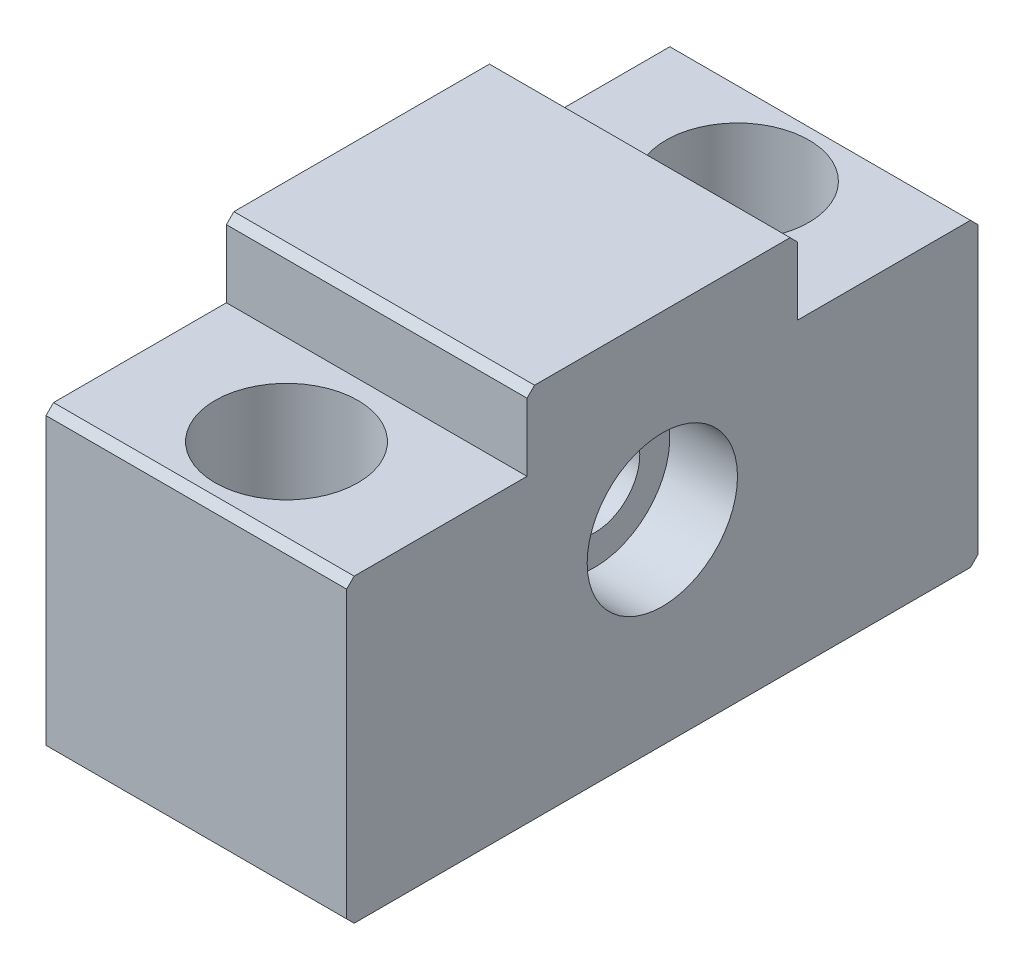
ISO-10303-21;
HEADER;
FILE_DESCRIPTION(('STEP AP214'),'2;1');
FILE_NAME('part.step','',(''),(''),'','','');
FILE_SCHEMA(('AUTOMOTIVE_DESIGN { 1 0 10303 214 1 1 1 1 }'));
ENDSEC;
DATA;
#1=APPLICATION_CONTEXT('core data for automotive mechanical design processes');
#2=APPLICATION_PROTOCOL_DEFINITION('international standard','automotive_design',2000,#1);
#3=PRODUCT_CONTEXT('',#1,'mechanical');
#4=PRODUCT('Part','Part','',(#3));
#5=PRODUCT_RELATED_PRODUCT_CATEGORY('part','',(#4));
#6=PRODUCT_DEFINITION_FORMATION('','',#4);
#7=PRODUCT_DEFINITION_CONTEXT('part definition',#1,'design');
#8=PRODUCT_DEFINITION('design','',#6,#7);
#9=PRODUCT_DEFINITION_SHAPE('','',#8);
#10=(LENGTH_UNIT() NAMED_UNIT(*) SI_UNIT(.MILLI.,.METRE.));
#11=(NAMED_UNIT(*) PLANE_ANGLE_UNIT() SI_UNIT($,.RADIAN.));
#12=(NAMED_UNIT(*) SI_UNIT($,.STERADIAN.) SOLID_ANGLE_UNIT());
#13=UNCERTAINTY_MEASURE_WITH_UNIT(LENGTH_MEASURE(1.E-05),#10,'distance_accuracy_value','');
#14=(GEOMETRIC_REPRESENTATION_CONTEXT(3) GLOBAL_UNCERTAINTY_ASSIGNED_CONTEXT((#13)) GLOBAL_UNIT_ASSIGNED_CONTEXT((#10,
#11,#12)) REPRESENTATION_CONTEXT('',''));
#15=CARTESIAN_POINT('',(0.,0.,0.));
#16=DIRECTION('',(0.,0.,1.));
#17=DIRECTION('',(1.,0.,0.));
#18=AXIS2_PLACEMENT_3D('',#15,#16,#17);
#19=CARTESIAN_POINT('',(-10.,19.5,21.));
#20=DIRECTION('',(0.,0.707106781186548,0.707106781186548));
#21=DIRECTION('',(1.,0.,0.));
#22=AXIS2_PLACEMENT_3D('',#19,#20,#21);
#23=PLANE('',#22);
#24=DIRECTION('',(0.,-0.707106781186548,0.707106781186548));
#25=VECTOR('',#24,1.);
#26=CARTESIAN_POINT('',(-10.,20.,20.5));
#27=LINE('',#26,#25);
#28=CARTESIAN_POINT('',(-10.,20.,20.5));
#29=VERTEX_POINT('',#28);
#30=CARTESIAN_POINT('',(-10.,19.5,21.));
#31=VERTEX_POINT('',#30);
#32=EDGE_CURVE('E120',#29,#31,#27,.T.);
#33=ORIENTED_EDGE('',*,*,#32,.T.);
#34=DIRECTION('',(1.,0.,0.));
#35=VECTOR('',#34,1.);
#36=CARTESIAN_POINT('',(-10.,19.5,21.));
#37=LINE('',#36,#35);
#38=CARTESIAN_POINT('',(10.,19.5,21.));
#39=VERTEX_POINT('',#38);
#40=EDGE_CURVE('E134',#39,#31,#37,.F.);
#41=ORIENTED_EDGE('',*,*,#40,.F.);
#42=DIRECTION('',(0.,0.707106781186548,-0.707106781186548));
#43=VECTOR('',#42,1.);
#44=CARTESIAN_POINT('',(10.,19.5,21.));
#45=LINE('',#44,#43);
#46=CARTESIAN_POINT('',(10.,20.,20.5));
#47=VERTEX_POINT('',#46);
#48=EDGE_CURVE('E140',#47,#39,#45,.F.);
#49=ORIENTED_EDGE('',*,*,#48,.F.);
#50=DIRECTION('',(-1.,0.,0.));
#51=VECTOR('',#50,1.);
#52=CARTESIAN_POINT('',(10.,20.,20.5));
#53=LINE('',#52,#51);
#54=EDGE_CURVE('E128',#47,#29,#53,.T.);
#55=ORIENTED_EDGE('',*,*,#54,.T.);
#56=EDGE_LOOP('',(#33,#41,#49,#55));
#57=FACE_BOUND('',#56,.T.);
#58=ADVANCED_FACE('F17',(#57),#23,.T.);
#59=CARTESIAN_POINT('',(10.,0.5,21.));
#60=DIRECTION('',(0.,0.,1.));
#61=DIRECTION('',(0.,1.,0.));
#62=AXIS2_PLACEMENT_3D('',#59,#60,#61);
#63=PLANE('',#62);
#64=DIRECTION('',(0.,-1.,0.));
#65=VECTOR('',#64,1.);
#66=CARTESIAN_POINT('',(-10.,19.5,21.));
#67=LINE('',#66,#65);
#68=CARTESIAN_POINT('',(-10.,0.5,21.));
#69=VERTEX_POINT('',#68);
#70=EDGE_CURVE('E116',#31,#69,#67,.T.);
#71=ORIENTED_EDGE('',*,*,#70,.T.);
#72=DIRECTION('',(1.,0.,0.));
#73=VECTOR('',#72,1.);
#74=CARTESIAN_POINT('',(-10.,0.5,21.));
#75=LINE('',#74,#73);
#76=CARTESIAN_POINT('',(10.,0.5,21.));
#77=VERTEX_POINT('',#76);
#78=EDGE_CURVE('E127',#77,#69,#75,.F.);
#79=ORIENTED_EDGE('',*,*,#78,.F.);
#80=DIRECTION('',(0.,1.,0.));
#81=VECTOR('',#80,1.);
#82=CARTESIAN_POINT('',(10.,0.5,21.));
#83=LINE('',#82,#81);
#84=EDGE_CURVE('E139',#39,#77,#83,.F.);
#85=ORIENTED_EDGE('',*,*,#84,.F.);
#86=ORIENTED_EDGE('',*,*,#40,.T.);
#87=EDGE_LOOP('',(#71,#79,#85,#86));
#88=FACE_BOUND('',#87,.T.);
#89=ADVANCED_FACE('F138',(#88),#63,.T.);
#90=CARTESIAN_POINT('',(-10.,0.,20.5));
#91=DIRECTION('',(0.,-0.707106781186548,0.707106781186547));
#92=DIRECTION('',(1.,0.,0.));
#93=AXIS2_PLACEMENT_3D('',#90,#91,#92);
#94=PLANE('',#93);
#95=DIRECTION('',(0.,-0.707106781186547,-0.707106781186548));
#96=VECTOR('',#95,1.);
#97=CARTESIAN_POINT('',(-10.,0.5,21.));
#98=LINE('',#97,#96);
#99=CARTESIAN_POINT('',(-10.,0.,20.5));
#100=VERTEX_POINT('',#99);
#101=EDGE_CURVE('E122',#69,#100,#98,.T.);
#102=ORIENTED_EDGE('',*,*,#101,.T.);
#103=DIRECTION('',(1.,0.,0.));
#104=VECTOR('',#103,1.);
#105=CARTESIAN_POINT('',(-10.,0.,20.5));
#106=LINE('',#105,#104);
#107=CARTESIAN_POINT('',(10.,0.,20.5));
#108=VERTEX_POINT('',#107);
#109=EDGE_CURVE('E162',#108,#100,#106,.F.);
#110=ORIENTED_EDGE('',*,*,#109,.F.);
#111=DIRECTION('',(0.,0.707106781186547,0.707106781186548));
#112=VECTOR('',#111,1.);
#113=CARTESIAN_POINT('',(10.,0.,20.5));
#114=LINE('',#113,#112);
#115=EDGE_CURVE('E167',#77,#108,#114,.F.);
#116=ORIENTED_EDGE('',*,*,#115,.F.);
#117=ORIENTED_EDGE('',*,*,#78,.T.);
#118=EDGE_LOOP('',(#102,#110,#116,#117));
#119=FACE_BOUND('',#118,.T.);
#120=ADVANCED_FACE('F379',(#119),#94,.T.);
#121=CARTESIAN_POINT('',(-10.,0.,-20.5));
#122=DIRECTION('',(0.,-1.,0.));
#123=DIRECTION('',(1.,0.,0.));
#124=AXIS2_PLACEMENT_3D('',#121,#122,#123);
#125=PLANE('',#124);
#126=DIRECTION('',(0.,0.,-1.));
#127=VECTOR('',#126,1.);
#128=CARTESIAN_POINT('',(-10.,0.,20.5));
#129=LINE('',#128,#127);
#130=CARTESIAN_POINT('',(-10.,0.,-20.5));
#131=VERTEX_POINT('',#130);
#132=EDGE_CURVE('E171',#100,#131,#129,.T.);
#133=ORIENTED_EDGE('',*,*,#132,.T.);
#134=DIRECTION('',(1.,0.,0.));
#135=VECTOR('',#134,1.);
#136=CARTESIAN_POINT('',(-10.,0.,-20.5));
#137=LINE('',#136,#135);
#138=CARTESIAN_POINT('',(10.,0.,-20.5));
#139=VERTEX_POINT('',#138);
#140=EDGE_CURVE('E176',#139,#131,#137,.F.);
#141=ORIENTED_EDGE('',*,*,#140,.F.);
#142=DIRECTION('',(0.,0.,1.));
#143=VECTOR('',#142,1.);
#144=CARTESIAN_POINT('',(10.,0.,-20.5));
#145=LINE('',#144,#143);
#146=EDGE_CURVE('E181',#108,#139,#145,.F.);
#147=ORIENTED_EDGE('',*,*,#146,.F.);
#148=ORIENTED_EDGE('',*,*,#109,.T.);
#149=EDGE_LOOP('',(#133,#141,#147,#148));
#150=FACE_BOUND('',#149,.T.);
#151=CARTESIAN_POINT('',(0.,0.,-15.));
#152=DIRECTION('',(0.,1.,0.));
#153=DIRECTION('',(0.,0.,-1.));
#154=AXIS2_PLACEMENT_3D('',#151,#152,#153);
#155=CIRCLE('',#154,2.75);
#156=CARTESIAN_POINT('',(0.,0.,-17.75));
#157=VERTEX_POINT('',#156);
#158=EDGE_CURVE('E185',#157,#157,#155,.F.);
#159=ORIENTED_EDGE('',*,*,#158,.F.);
#160=EDGE_LOOP('',(#159));
#161=FACE_BOUND('',#160,.T.);
#162=CARTESIAN_POINT('',(0.,0.,15.));
#163=DIRECTION('',(0.,1.,0.));
#164=DIRECTION('',(0.,0.,-1.));
#165=AXIS2_PLACEMENT_3D('',#162,#163,#164);
#166=CIRCLE('',#165,2.75);
#167=CARTESIAN_POINT('',(0.,0.,12.25));
#168=VERTEX_POINT('',#167);
#169=EDGE_CURVE('E190',#168,#168,#166,.T.);
#170=ORIENTED_EDGE('',*,*,#169,.T.);
#171=EDGE_LOOP('',(#170));
#172=FACE_BOUND('',#171,.T.);
#173=ADVANCED_FACE('F384',(#150,#161,#172),#125,.T.);
#174=CARTESIAN_POINT('',(-10.,0.500000000000003,-21.));
#175=DIRECTION('',(0.,-0.707106781186548,-0.707106781186547));
#176=DIRECTION('',(1.,0.,0.));
#177=AXIS2_PLACEMENT_3D('',#174,#175,#176);
#178=PLANE('',#177);
#179=DIRECTION('',(0.,0.707106781186546,-0.707106781186549));
#180=VECTOR('',#179,1.);
#181=CARTESIAN_POINT('',(-10.,0.,-20.5));
#182=LINE('',#181,#180);
#183=CARTESIAN_POINT('',(-10.,0.500000000000003,-21.));
#184=VERTEX_POINT('',#183);
#185=EDGE_CURVE('E193',#131,#184,#182,.T.);
#186=ORIENTED_EDGE('',*,*,#185,.T.);
#187=DIRECTION('',(1.,0.,0.));
#188=VECTOR('',#187,1.);
#189=CARTESIAN_POINT('',(-10.,0.500000000000003,-21.));
#190=LINE('',#189,#188);
#191=CARTESIAN_POINT('',(10.,0.499999999999999,-21.));
#192=VERTEX_POINT('',#191);
#193=EDGE_CURVE('E196',#192,#184,#190,.F.);
#194=ORIENTED_EDGE('',*,*,#193,.F.);
#195=DIRECTION('',(0.,-0.707106781186547,0.707106781186548));
#196=VECTOR('',#195,1.);
#197=CARTESIAN_POINT('',(10.,0.499999999999999,-21.));
#198=LINE('',#197,#196);
#199=EDGE_CURVE('E201',#139,#192,#198,.F.);
#200=ORIENTED_EDGE('',*,*,#199,.F.);
#201=ORIENTED_EDGE('',*,*,#140,.T.);
#202=EDGE_LOOP('',(#186,#194,#200,#201));
#203=FACE_BOUND('',#202,.T.);
#204=ADVANCED_FACE('F388',(#203),#178,.T.);
#205=CARTESIAN_POINT('',(-10.,0.5,-21.));
#206=DIRECTION('',(0.,0.,-1.));
#207=DIRECTION('',(0.,1.,0.));
#208=AXIS2_PLACEMENT_3D('',#205,#206,#207);
#209=PLANE('',#208);
#210=DIRECTION('',(0.,1.,0.));
#211=VECTOR('',#210,1.);
#212=CARTESIAN_POINT('',(-10.,0.5,-21.));
#213=LINE('',#212,#211);
#214=CARTESIAN_POINT('',(-10.,19.5,-21.));
#215=VERTEX_POINT('',#214);
#216=EDGE_CURVE('E205',#184,#215,#213,.T.);
#217=ORIENTED_EDGE('',*,*,#216,.T.);
#218=DIRECTION('',(1.,0.,0.));
#219=VECTOR('',#218,1.);
#220=CARTESIAN_POINT('',(-10.,19.5,-21.));
#221=LINE('',#220,#219);
#222=CARTESIAN_POINT('',(10.,19.5,-21.));
#223=VERTEX_POINT('',#222);
#224=EDGE_CURVE('E210',#223,#215,#221,.F.);
#225=ORIENTED_EDGE('',*,*,#224,.F.);
#226=DIRECTION('',(0.,-1.,0.));
#227=VECTOR('',#226,1.);
#228=CARTESIAN_POINT('',(10.,19.5,-21.));
#229=LINE('',#228,#227);
#230=EDGE_CURVE('E215',#192,#223,#229,.F.);
#231=ORIENTED_EDGE('',*,*,#230,.F.);
#232=ORIENTED_EDGE('',*,*,#193,.T.);
#233=EDGE_LOOP('',(#217,#225,#231,#232));
#234=FACE_BOUND('',#233,.T.);
#235=ADVANCED_FACE('F392',(#234),#209,.T.);
#236=CARTESIAN_POINT('',(-10.,20.,-20.5));
#237=DIRECTION('',(0.,0.707106781186548,-0.707106781186548));
#238=DIRECTION('',(1.,0.,0.));
#239=AXIS2_PLACEMENT_3D('',#236,#237,#238);
#240=PLANE('',#239);
#241=DIRECTION('',(0.,0.707106781186548,0.707106781186548));
#242=VECTOR('',#241,1.);
#243=CARTESIAN_POINT('',(-10.,19.5,-21.));
#244=LINE('',#243,#242);
#245=CARTESIAN_POINT('',(-10.,20.,-20.5));
#246=VERTEX_POINT('',#245);
#247=EDGE_CURVE('E219',#215,#246,#244,.T.);
#248=ORIENTED_EDGE('',*,*,#247,.T.);
#249=DIRECTION('',(1.,0.,0.));
#250=VECTOR('',#249,1.);
#251=CARTESIAN_POINT('',(-10.,20.,-20.5));
#252=LINE('',#251,#250);
#253=CARTESIAN_POINT('',(10.,20.,-20.5));
#254=VERTEX_POINT('',#253);
#255=EDGE_CURVE('E224',#254,#246,#252,.F.);
#256=ORIENTED_EDGE('',*,*,#255,.F.);
#257=DIRECTION('',(0.,-0.707106781186548,-0.707106781186548));
#258=VECTOR('',#257,1.);
#259=CARTESIAN_POINT('',(10.,20.,-20.5));
#260=LINE('',#259,#258);
#261=EDGE_CURVE('E229',#223,#254,#260,.F.);
#262=ORIENTED_EDGE('',*,*,#261,.F.);
#263=ORIENTED_EDGE('',*,*,#224,.T.);
#264=EDGE_LOOP('',(#248,#256,#262,#263));
#265=FACE_BOUND('',#264,.T.);
#266=ADVANCED_FACE('F396',(#265),#240,.T.);
#267=CARTESIAN_POINT('',(-10.,20.,-9.));
#268=DIRECTION('',(0.,1.,0.));
#269=DIRECTION('',(1.,0.,0.));
#270=AXIS2_PLACEMENT_3D('',#267,#268,#269);
#271=PLANE('',#270);
#272=DIRECTION('',(0.,0.,1.));
#273=VECTOR('',#272,1.);
#274=CARTESIAN_POINT('',(-10.,20.,-20.5));
#275=LINE('',#274,#273);
#276=CARTESIAN_POINT('',(-10.,20.,-9.));
#277=VERTEX_POINT('',#276);
#278=EDGE_CURVE('E233',#246,#277,#275,.T.);
#279=ORIENTED_EDGE('',*,*,#278,.T.);
#280=DIRECTION('',(1.,0.,0.));
#281=VECTOR('',#280,1.);
#282=CARTESIAN_POINT('',(-10.,20.,-9.));
#283=LINE('',#282,#281);
#284=CARTESIAN_POINT('',(10.,20.,-9.));
#285=VERTEX_POINT('',#284);
#286=EDGE_CURVE('E238',#285,#277,#283,.F.);
#287=ORIENTED_EDGE('',*,*,#286,.F.);
#288=DIRECTION('',(0.,0.,-1.));
#289=VECTOR('',#288,1.);
#290=CARTESIAN_POINT('',(10.,20.,-9.));
#291=LINE('',#290,#289);
#292=EDGE_CURVE('E243',#254,#285,#291,.F.);
#293=ORIENTED_EDGE('',*,*,#292,.F.);
#294=ORIENTED_EDGE('',*,*,#255,.T.);
#295=EDGE_LOOP('',(#279,#287,#293,#294));
#296=FACE_BOUND('',#295,.T.);
#297=CARTESIAN_POINT('',(0.,20.,-15.));
#298=DIRECTION('',(0.,-1.,0.));
#299=DIRECTION('',(0.,0.,1.));
#300=AXIS2_PLACEMENT_3D('',#297,#298,#299);
#301=CIRCLE('',#300,4.75);
#302=CARTESIAN_POINT('',(0.,20.,-10.25));
#303=VERTEX_POINT('',#302);
#304=EDGE_CURVE('E247',#303,#303,#301,.T.);
#305=ORIENTED_EDGE('',*,*,#304,.T.);
#306=EDGE_LOOP('',(#305));
#307=FACE_BOUND('',#306,.T.);
#308=ADVANCED_FACE('F400',(#296,#307),#271,.T.);
#309=CARTESIAN_POINT('',(-10.,20.,-9.));
#310=DIRECTION('',(0.,0.,-1.));
#311=DIRECTION('',(0.,1.,0.));
#312=AXIS2_PLACEMENT_3D('',#309,#310,#311);
#313=PLANE('',#312);
#314=DIRECTION('',(0.,1.,0.));
#315=VECTOR('',#314,1.);
#316=CARTESIAN_POINT('',(-10.,20.,-9.));
#317=LINE('',#316,#315);
#318=CARTESIAN_POINT('',(-10.,24.5,-9.));
#319=VERTEX_POINT('',#318);
#320=EDGE_CURVE('E252',#277,#319,#317,.T.);
#321=ORIENTED_EDGE('',*,*,#320,.T.);
#322=DIRECTION('',(1.,0.,0.));
#323=VECTOR('',#322,1.);
#324=CARTESIAN_POINT('',(-10.,24.5,-9.));
#325=LINE('',#324,#323);
#326=CARTESIAN_POINT('',(10.,24.5,-9.));
#327=VERTEX_POINT('',#326);
#328=EDGE_CURVE('E255',#327,#319,#325,.F.);
#329=ORIENTED_EDGE('',*,*,#328,.F.);
#330=DIRECTION('',(0.,-1.,0.));
#331=VECTOR('',#330,1.);
#332=CARTESIAN_POINT('',(10.,24.5,-9.));
#333=LINE('',#332,#331);
#334=EDGE_CURVE('E260',#285,#327,#333,.F.);
#335=ORIENTED_EDGE('',*,*,#334,.F.);
#336=ORIENTED_EDGE('',*,*,#286,.T.);
#337=EDGE_LOOP('',(#321,#329,#335,#336));
#338=FACE_BOUND('',#337,.T.);
#339=ADVANCED_FACE('F404',(#338),#313,.T.);
#340=CARTESIAN_POINT('',(-10.,25.,-8.5));
#341=DIRECTION('',(0.,0.707106781186548,-0.707106781186548));
#342=DIRECTION('',(1.,0.,0.));
#343=AXIS2_PLACEMENT_3D('',#340,#341,#342);
#344=PLANE('',#343);
#345=DIRECTION('',(0.,0.707106781186548,0.707106781186548));
#346=VECTOR('',#345,1.);
#347=CARTESIAN_POINT('',(-10.,24.5,-9.));
#348=LINE('',#347,#346);
#349=CARTESIAN_POINT('',(-10.,25.,-8.5));
#350=VERTEX_POINT('',#349);
#351=EDGE_CURVE('E264',#319,#350,#348,.T.);
#352=ORIENTED_EDGE('',*,*,#351,.T.);
#353=DIRECTION('',(1.,0.,0.));
#354=VECTOR('',#353,1.);
#355=CARTESIAN_POINT('',(-10.,25.,-8.5));
#356=LINE('',#355,#354);
#357=CARTESIAN_POINT('',(10.,25.,-8.5));
#358=VERTEX_POINT('',#357);
#359=EDGE_CURVE('E269',#358,#350,#356,.F.);
#360=ORIENTED_EDGE('',*,*,#359,.F.);
#361=DIRECTION('',(0.,-0.707106781186548,-0.707106781186548));
#362=VECTOR('',#361,1.);
#363=CARTESIAN_POINT('',(10.,25.,-8.5));
#364=LINE('',#363,#362);
#365=EDGE_CURVE('E274',#327,#358,#364,.F.);
#366=ORIENTED_EDGE('',*,*,#365,.F.);
#367=ORIENTED_EDGE('',*,*,#328,.T.);
#368=EDGE_LOOP('',(#352,#360,#366,#367));
#369=FACE_BOUND('',#368,.T.);
#370=ADVANCED_FACE('F408',(#369),#344,.T.);
#371=CARTESIAN_POINT('',(-10.,25.,8.5));
#372=DIRECTION('',(0.,1.,0.));
#373=DIRECTION('',(1.,0.,0.));
#374=AXIS2_PLACEMENT_3D('',#371,#372,#373);
#375=PLANE('',#374);
#376=DIRECTION('',(0.,0.,1.));
#377=VECTOR('',#376,1.);
#378=CARTESIAN_POINT('',(-10.,25.,-8.5));
#379=LINE('',#378,#377);
#380=CARTESIAN_POINT('',(-10.,25.,8.5));
#381=VERTEX_POINT('',#380);
#382=EDGE_CURVE('E278',#350,#381,#379,.T.);
#383=ORIENTED_EDGE('',*,*,#382,.T.);
#384=DIRECTION('',(1.,0.,0.));
#385=VECTOR('',#384,1.);
#386=CARTESIAN_POINT('',(-10.,25.,8.5));
#387=LINE('',#386,#385);
#388=CARTESIAN_POINT('',(10.,25.,8.5));
#389=VERTEX_POINT('',#388);
#390=EDGE_CURVE('E283',#389,#381,#387,.F.);
#391=ORIENTED_EDGE('',*,*,#390,.F.);
#392=DIRECTION('',(0.,0.,-1.));
#393=VECTOR('',#392,1.);
#394=CARTESIAN_POINT('',(10.,25.,8.5));
#395=LINE('',#394,#393);
#396=EDGE_CURVE('E288',#358,#389,#395,.F.);
#397=ORIENTED_EDGE('',*,*,#396,.F.);
#398=ORIENTED_EDGE('',*,*,#359,.T.);
#399=EDGE_LOOP('',(#383,#391,#397,#398));
#400=FACE_BOUND('',#399,.T.);
#401=ADVANCED_FACE('F412',(#400),#375,.T.);
#402=CARTESIAN_POINT('',(-10.,24.5,9.));
#403=DIRECTION('',(0.,0.707106781186548,0.707106781186548));
#404=DIRECTION('',(1.,0.,0.));
#405=AXIS2_PLACEMENT_3D('',#402,#403,#404);
#406=PLANE('',#405);
#407=DIRECTION('',(0.,-0.707106781186548,0.707106781186548));
#408=VECTOR('',#407,1.);
#409=CARTESIAN_POINT('',(-10.,25.,8.5));
#410=LINE('',#409,#408);
#411=CARTESIAN_POINT('',(-10.,24.5,9.));
#412=VERTEX_POINT('',#411);
#413=EDGE_CURVE('E292',#381,#412,#410,.T.);
#414=ORIENTED_EDGE('',*,*,#413,.T.);
#415=DIRECTION('',(1.,0.,0.));
#416=VECTOR('',#415,1.);
#417=CARTESIAN_POINT('',(-10.,24.5,9.));
#418=LINE('',#417,#416);
#419=CARTESIAN_POINT('',(10.,24.5,9.));
#420=VERTEX_POINT('',#419);
#421=EDGE_CURVE('E297',#420,#412,#418,.F.);
#422=ORIENTED_EDGE('',*,*,#421,.F.);
#423=DIRECTION('',(0.,0.707106781186549,-0.707106781186546));
#424=VECTOR('',#423,1.);
#425=CARTESIAN_POINT('',(10.,24.5,9.));
#426=LINE('',#425,#424);
#427=EDGE_CURVE('E302',#389,#420,#426,.F.);
#428=ORIENTED_EDGE('',*,*,#427,.F.);
#429=ORIENTED_EDGE('',*,*,#390,.T.);
#430=EDGE_LOOP('',(#414,#422,#428,#429));
#431=FACE_BOUND('',#430,.T.);
#432=ADVANCED_FACE('F416',(#431),#406,.T.);
#433=CARTESIAN_POINT('',(10.,20.,9.));
#434=DIRECTION('',(0.,0.,1.));
#435=DIRECTION('',(0.,1.,0.));
#436=AXIS2_PLACEMENT_3D('',#433,#434,#435);
#437=PLANE('',#436);
#438=DIRECTION('',(0.,-1.,0.));
#439=VECTOR('',#438,1.);
#440=CARTESIAN_POINT('',(-10.,24.5,9.));
#441=LINE('',#440,#439);
#442=CARTESIAN_POINT('',(-10.,20.,9.));
#443=VERTEX_POINT('',#442);
#444=EDGE_CURVE('E306',#412,#443,#441,.T.);
#445=ORIENTED_EDGE('',*,*,#444,.T.);
#446=DIRECTION('',(1.,0.,0.));
#447=VECTOR('',#446,1.);
#448=CARTESIAN_POINT('',(-10.,20.,9.));
#449=LINE('',#448,#447);
#450=CARTESIAN_POINT('',(10.,20.,9.));
#451=VERTEX_POINT('',#450);
#452=EDGE_CURVE('E310',#451,#443,#449,.F.);
#453=ORIENTED_EDGE('',*,*,#452,.F.);
#454=DIRECTION('',(0.,1.,0.));
#455=VECTOR('',#454,1.);
#456=CARTESIAN_POINT('',(10.,20.,9.));
#457=LINE('',#456,#455);
#458=EDGE_CURVE('E32',#420,#451,#457,.F.);
#459=ORIENTED_EDGE('',*,*,#458,.F.);
#460=ORIENTED_EDGE('',*,*,#421,.T.);
#461=EDGE_LOOP('',(#445,#453,#459,#460));
#462=FACE_BOUND('',#461,.T.);
#463=ADVANCED_FACE('F420',(#462),#437,.T.);
#464=CARTESIAN_POINT('',(-10.,20.,20.5));
#465=DIRECTION('',(0.,1.,0.));
#466=DIRECTION('',(1.,0.,0.));
#467=AXIS2_PLACEMENT_3D('',#464,#465,#466);
#468=PLANE('',#467);
#469=DIRECTION('',(0.,0.,1.));
#470=VECTOR('',#469,1.);
#471=CARTESIAN_POINT('',(-10.,20.,9.));
#472=LINE('',#471,#470);
#473=EDGE_CURVE('E40',#443,#29,#472,.T.);
#474=ORIENTED_EDGE('',*,*,#473,.T.);
#475=ORIENTED_EDGE('',*,*,#54,.F.);
#476=DIRECTION('',(0.,0.,-1.));
#477=VECTOR('',#476,1.);
#478=CARTESIAN_POINT('',(10.,20.,20.5));
#479=LINE('',#478,#477);
#480=EDGE_CURVE('E321',#451,#47,#479,.F.);
#481=ORIENTED_EDGE('',*,*,#480,.F.);
#482=ORIENTED_EDGE('',*,*,#452,.T.);
#483=EDGE_LOOP('',(#474,#475,#481,#482));
#484=FACE_BOUND('',#483,.T.);
#485=CARTESIAN_POINT('',(0.,20.,15.));
#486=DIRECTION('',(0.,-1.,0.));
#487=DIRECTION('',(0.,0.,1.));
#488=AXIS2_PLACEMENT_3D('',#485,#486,#487);
#489=CIRCLE('',#488,4.75);
#490=CARTESIAN_POINT('',(0.,20.,19.75));
#491=VERTEX_POINT('',#490);
#492=EDGE_CURVE('E325',#491,#491,#489,.F.);
#493=ORIENTED_EDGE('',*,*,#492,.F.);
#494=EDGE_LOOP('',(#493));
#495=FACE_BOUND('',#494,.T.);
#496=ADVANCED_FACE('F424',(#484,#495),#468,.T.);
#497=CARTESIAN_POINT('',(10.,0.,21.));
#498=DIRECTION('',(1.,0.,0.));
#499=DIRECTION('',(0.,0.,-1.));
#500=AXIS2_PLACEMENT_3D('',#497,#498,#499);
#501=PLANE('',#500);
#502=ORIENTED_EDGE('',*,*,#48,.T.);
#503=ORIENTED_EDGE('',*,*,#84,.T.);
#504=ORIENTED_EDGE('',*,*,#115,.T.);
#505=ORIENTED_EDGE('',*,*,#146,.T.);
#506=ORIENTED_EDGE('',*,*,#199,.T.);
#507=ORIENTED_EDGE('',*,*,#230,.T.);
#508=ORIENTED_EDGE('',*,*,#261,.T.);
#509=ORIENTED_EDGE('',*,*,#292,.T.);
#510=ORIENTED_EDGE('',*,*,#334,.T.);
#511=ORIENTED_EDGE('',*,*,#365,.T.);
#512=ORIENTED_EDGE('',*,*,#396,.T.);
#513=ORIENTED_EDGE('',*,*,#427,.T.);
#514=ORIENTED_EDGE('',*,*,#458,.T.);
#515=ORIENTED_EDGE('',*,*,#480,.T.);
#516=EDGE_LOOP('',(#502,#503,#504,#505,#506,#507,#508,#509,#510,#511,#512,#513,#514,#515));
#517=FACE_BOUND('',#516,.T.);
#518=CARTESIAN_POINT('',(10.,13.,0.));
#519=DIRECTION('',(-1.,0.,0.));
#520=DIRECTION('',(0.,0.,-1.));
#521=AXIS2_PLACEMENT_3D('',#518,#519,#520);
#522=CIRCLE('',#521,5.);
#523=CARTESIAN_POINT('',(10.,13.,-5.));
#524=VERTEX_POINT('',#523);
#525=EDGE_CURVE('E330',#524,#524,#522,.F.);
#526=ORIENTED_EDGE('',*,*,#525,.F.);
#527=EDGE_LOOP('',(#526));
#528=FACE_BOUND('',#527,.T.);
#529=ADVANCED_FACE('F428',(#517,#528),#501,.T.);
#530=CARTESIAN_POINT('',(-10.,0.,21.));
#531=DIRECTION('',(-1.,0.,0.));
#532=DIRECTION('',(0.,1.,0.));
#533=AXIS2_PLACEMENT_3D('',#530,#531,#532);
#534=PLANE('',#533);
#535=ORIENTED_EDGE('',*,*,#32,.F.);
#536=ORIENTED_EDGE('',*,*,#473,.F.);
#537=ORIENTED_EDGE('',*,*,#444,.F.);
#538=ORIENTED_EDGE('',*,*,#413,.F.);
#539=ORIENTED_EDGE('',*,*,#382,.F.);
#540=ORIENTED_EDGE('',*,*,#351,.F.);
#541=ORIENTED_EDGE('',*,*,#320,.F.);
#542=ORIENTED_EDGE('',*,*,#278,.F.);
#543=ORIENTED_EDGE('',*,*,#247,.F.);
#544=ORIENTED_EDGE('',*,*,#216,.F.);
#545=ORIENTED_EDGE('',*,*,#185,.F.);
#546=ORIENTED_EDGE('',*,*,#132,.F.);
#547=ORIENTED_EDGE('',*,*,#101,.F.);
#548=ORIENTED_EDGE('',*,*,#70,.F.);
#549=EDGE_LOOP('',(#535,#536,#537,#538,#539,#540,#541,#542,#543,#544,#545,#546,#547,#548));
#550=FACE_BOUND('',#549,.T.);
#551=CARTESIAN_POINT('',(-10.,13.,0.));
#552=DIRECTION('',(1.,0.,0.));
#553=DIRECTION('',(0.,0.,1.));
#554=AXIS2_PLACEMENT_3D('',#551,#552,#553);
#555=CIRCLE('',#554,7.);
#556=CARTESIAN_POINT('',(-10.,13.,7.));
#557=VERTEX_POINT('',#556);
#558=EDGE_CURVE('E333',#557,#557,#555,.T.);
#559=ORIENTED_EDGE('',*,*,#558,.T.);
#560=EDGE_LOOP('',(#559));
#561=FACE_BOUND('',#560,.T.);
#562=ADVANCED_FACE('F118',(#550,#561),#534,.T.);
#563=CARTESIAN_POINT('',(-9.3,5.80873229638835,-7.));
#564=DIRECTION('',(-1.,0.,0.));
#565=DIRECTION('',(0.,0.,1.));
#566=AXIS2_PLACEMENT_3D('',#563,#564,#565);
#567=PLANE('',#566);
#568=CARTESIAN_POINT('',(-9.3,13.,0.));
#569=DIRECTION('',(-1.,0.,0.));
#570=DIRECTION('',(0.,0.,-1.));
#571=AXIS2_PLACEMENT_3D('',#568,#569,#570);
#572=CIRCLE('',#571,7.);
#573=CARTESIAN_POINT('',(-9.3,13.,-7.));
#574=VERTEX_POINT('',#573);
#575=EDGE_CURVE('E336',#574,#574,#572,.F.);
#576=ORIENTED_EDGE('',*,*,#575,.F.);
#577=EDGE_LOOP('',(#576));
#578=FACE_BOUND('',#577,.T.);
#579=CARTESIAN_POINT('',(-9.3,13.,0.));
#580=DIRECTION('',(1.,0.,0.));
#581=DIRECTION('',(0.,-1.42053882967732E-07,0.99999999999999));
#582=AXIS2_PLACEMENT_3D('',#579,#580,#581);
#583=CIRCLE('',#582,5.);
#584=CARTESIAN_POINT('',(-9.3,12.9999992897306,4.99999999999995));
#585=VERTEX_POINT('',#584);
#586=EDGE_CURVE('E339',#585,#585,#583,.T.);
#587=ORIENTED_EDGE('',*,*,#586,.T.);
#588=EDGE_LOOP('',(#587));
#589=FACE_BOUND('',#588,.T.);
#590=ADVANCED_FACE('F434',(#578,#589),#567,.T.);
#591=CARTESIAN_POINT('',(-6.5,8.,-5.));
#592=DIRECTION('',(-1.,0.,0.));
#593=DIRECTION('',(0.,0.,1.));
#594=AXIS2_PLACEMENT_3D('',#591,#592,#593);
#595=PLANE('',#594);
#596=CARTESIAN_POINT('',(-6.5,13.,0.));
#597=DIRECTION('',(-1.,0.,0.));
#598=DIRECTION('',(0.,0.,-1.));
#599=AXIS2_PLACEMENT_3D('',#596,#597,#598);
#600=CIRCLE('',#599,5.);
#601=CARTESIAN_POINT('',(-6.5,13.,-5.));
#602=VERTEX_POINT('',#601);
#603=EDGE_CURVE('E342',#602,#602,#600,.F.);
#604=ORIENTED_EDGE('',*,*,#603,.F.);
#605=EDGE_LOOP('',(#604));
#606=FACE_BOUND('',#605,.T.);
#607=CARTESIAN_POINT('',(-6.5,13.,0.));
#608=DIRECTION('',(1.,0.,0.));
#609=DIRECTION('',(0.,0.,1.));
#610=AXIS2_PLACEMENT_3D('',#607,#608,#609);
#611=CIRCLE('',#610,3.);
#612=CARTESIAN_POINT('',(-6.5,13.,3.));
#613=VERTEX_POINT('',#612);
#614=EDGE_CURVE('E345',#613,#613,#611,.T.);
#615=ORIENTED_EDGE('',*,*,#614,.T.);
#616=EDGE_LOOP('',(#615));
#617=FACE_BOUND('',#616,.T.);
#618=ADVANCED_FACE('F437',(#606,#617),#595,.T.);
#619=CARTESIAN_POINT('',(5.5,8.00000024228893,5.00000038389405));
#620=DIRECTION('',(1.,0.,0.));
#621=DIRECTION('',(0.,0.,-1.));
#622=AXIS2_PLACEMENT_3D('',#619,#620,#621);
#623=PLANE('',#622);
#624=CARTESIAN_POINT('',(5.5,13.,0.));
#625=DIRECTION('',(1.,0.,0.));
#626=DIRECTION('',(0.,-1.42067199959684E-07,0.99999999999999));
#627=AXIS2_PLACEMENT_3D('',#624,#625,#626);
#628=CIRCLE('',#627,5.);
#629=CARTESIAN_POINT('',(5.5,12.999999289664,4.99999999999995));
#630=VERTEX_POINT('',#629);
#631=EDGE_CURVE('E348',#630,#630,#628,.T.);
#632=ORIENTED_EDGE('',*,*,#631,.T.);
#633=EDGE_LOOP('',(#632));
#634=FACE_BOUND('',#633,.T.);
#635=CARTESIAN_POINT('',(5.5,13.,0.));
#636=DIRECTION('',(-1.,0.,0.));
#637=DIRECTION('',(0.,0.,-1.));
#638=AXIS2_PLACEMENT_3D('',#635,#636,#637);
#639=CIRCLE('',#638,3.);
#640=CARTESIAN_POINT('',(5.5,13.,-3.));
#641=VERTEX_POINT('',#640);
#642=EDGE_CURVE('E351',#641,#641,#639,.F.);
#643=ORIENTED_EDGE('',*,*,#642,.F.);
#644=EDGE_LOOP('',(#643));
#645=FACE_BOUND('',#644,.T.);
#646=ADVANCED_FACE('F441',(#634,#645),#623,.T.);
#647=CARTESIAN_POINT('',(-4.75,9.,-19.75));
#648=DIRECTION('',(0.,1.,0.));
#649=DIRECTION('',(0.,0.,1.));
#650=AXIS2_PLACEMENT_3D('',#647,#648,#649);
#651=PLANE('',#650);
#652=CARTESIAN_POINT('',(0.,9.,-15.));
#653=DIRECTION('',(0.,1.,0.));
#654=DIRECTION('',(0.,0.,-1.));
#655=AXIS2_PLACEMENT_3D('',#652,#653,#654);
#656=CIRCLE('',#655,4.75);
#657=CARTESIAN_POINT('',(0.,9.,-19.75));
#658=VERTEX_POINT('',#657);
#659=EDGE_CURVE('E354',#658,#658,#656,.F.);
#660=ORIENTED_EDGE('',*,*,#659,.F.);
#661=EDGE_LOOP('',(#660));
#662=FACE_BOUND('',#661,.T.);
#663=CARTESIAN_POINT('',(0.,9.,-15.));
#664=DIRECTION('',(0.,-1.,0.));
#665=DIRECTION('',(0.,0.,1.));
#666=AXIS2_PLACEMENT_3D('',#663,#664,#665);
#667=CIRCLE('',#666,2.75);
#668=CARTESIAN_POINT('',(0.,9.,-12.25));
#669=VERTEX_POINT('',#668);
#670=EDGE_CURVE('E357',#669,#669,#667,.T.);
#671=ORIENTED_EDGE('',*,*,#670,.T.);
#672=EDGE_LOOP('',(#671));
#673=FACE_BOUND('',#672,.T.);
#674=ADVANCED_FACE('F445',(#662,#673),#651,.T.);
#675=CARTESIAN_POINT('',(-4.75,9.,10.25));
#676=DIRECTION('',(0.,1.,0.));
#677=DIRECTION('',(0.,0.,1.));
#678=AXIS2_PLACEMENT_3D('',#675,#676,#677);
#679=PLANE('',#678);
#680=CARTESIAN_POINT('',(0.,9.,15.));
#681=DIRECTION('',(0.,1.,0.));
#682=DIRECTION('',(0.,0.,-1.));
#683=AXIS2_PLACEMENT_3D('',#680,#681,#682);
#684=CIRCLE('',#683,4.75);
#685=CARTESIAN_POINT('',(0.,9.,10.25));
#686=VERTEX_POINT('',#685);
#687=EDGE_CURVE('E25',#686,#686,#684,.T.);
#688=ORIENTED_EDGE('',*,*,#687,.T.);
#689=EDGE_LOOP('',(#688));
#690=FACE_BOUND('',#689,.T.);
#691=CARTESIAN_POINT('',(0.,9.,15.));
#692=DIRECTION('',(0.,-1.,0.));
#693=DIRECTION('',(0.,0.,1.));
#694=AXIS2_PLACEMENT_3D('',#691,#692,#693);
#695=CIRCLE('',#694,2.75);
#696=CARTESIAN_POINT('',(0.,9.,17.75));
#697=VERTEX_POINT('',#696);
#698=EDGE_CURVE('E11',#697,#697,#695,.F.);
#699=ORIENTED_EDGE('',*,*,#698,.F.);
#700=EDGE_LOOP('',(#699));
#701=FACE_BOUND('',#700,.T.);
#702=ADVANCED_FACE('F362',(#690,#701),#679,.T.);
#703=CARTESIAN_POINT('',(10.,13.,0.));
#704=DIRECTION('',(1.,0.,0.));
#705=DIRECTION('',(0.,0.,1.));
#706=AXIS2_PLACEMENT_3D('',#703,#704,#705);
#707=CYLINDRICAL_SURFACE('',#706,7.);
#708=ORIENTED_EDGE('',*,*,#575,.T.);
#709=EDGE_LOOP('',(#708));
#710=FACE_BOUND('',#709,.T.);
#711=ORIENTED_EDGE('',*,*,#558,.F.);
#712=EDGE_LOOP('',(#711));
#713=FACE_BOUND('',#712,.T.);
#714=ADVANCED_FACE('F452',(#710,#713),#707,.F.);
#715=CARTESIAN_POINT('',(10.,13.,0.));
#716=DIRECTION('',(1.,0.,0.));
#717=DIRECTION('',(0.,0.,1.));
#718=AXIS2_PLACEMENT_3D('',#715,#716,#717);
#719=CYLINDRICAL_SURFACE('',#718,5.);
#720=ORIENTED_EDGE('',*,*,#603,.T.);
#721=EDGE_LOOP('',(#720));
#722=FACE_BOUND('',#721,.T.);
#723=ORIENTED_EDGE('',*,*,#586,.F.);
#724=EDGE_LOOP('',(#723));
#725=FACE_BOUND('',#724,.T.);
#726=ADVANCED_FACE('F455',(#722,#725),#719,.F.);
#727=CARTESIAN_POINT('',(10.,13.,0.));
#728=DIRECTION('',(1.,0.,0.));
#729=DIRECTION('',(0.,0.,1.));
#730=AXIS2_PLACEMENT_3D('',#727,#728,#729);
#731=CYLINDRICAL_SURFACE('',#730,3.);
#732=ORIENTED_EDGE('',*,*,#642,.T.);
#733=EDGE_LOOP('',(#732));
#734=FACE_BOUND('',#733,.T.);
#735=ORIENTED_EDGE('',*,*,#614,.F.);
#736=EDGE_LOOP('',(#735));
#737=FACE_BOUND('',#736,.T.);
#738=ADVANCED_FACE('F459',(#734,#737),#731,.F.);
#739=CARTESIAN_POINT('',(10.,13.,0.));
#740=DIRECTION('',(1.,0.,0.));
#741=DIRECTION('',(0.,0.,1.));
#742=AXIS2_PLACEMENT_3D('',#739,#740,#741);
#743=CYLINDRICAL_SURFACE('',#742,5.);
#744=ORIENTED_EDGE('',*,*,#525,.T.);
#745=EDGE_LOOP('',(#744));
#746=FACE_BOUND('',#745,.T.);
#747=ORIENTED_EDGE('',*,*,#631,.F.);
#748=EDGE_LOOP('',(#747));
#749=FACE_BOUND('',#748,.T.);
#750=ADVANCED_FACE('F463',(#746,#749),#743,.F.);
#751=CARTESIAN_POINT('',(0.,0.,-15.));
#752=DIRECTION('',(0.,-1.,0.));
#753=DIRECTION('',(0.,0.,1.));
#754=AXIS2_PLACEMENT_3D('',#751,#752,#753);
#755=CYLINDRICAL_SURFACE('',#754,4.75);
#756=ORIENTED_EDGE('',*,*,#659,.T.);
#757=EDGE_LOOP('',(#756));
#758=FACE_BOUND('',#757,.T.);
#759=ORIENTED_EDGE('',*,*,#304,.F.);
#760=EDGE_LOOP('',(#759));
#761=FACE_BOUND('',#760,.T.);
#762=ADVANCED_FACE('F467',(#758,#761),#755,.F.);
#763=CARTESIAN_POINT('',(0.,0.,-15.));
#764=DIRECTION('',(0.,-1.,0.));
#765=DIRECTION('',(1.42053898988588E-07,0.,0.99999999999999));
#766=AXIS2_PLACEMENT_3D('',#763,#764,#765);
#767=CYLINDRICAL_SURFACE('',#766,2.75);
#768=ORIENTED_EDGE('',*,*,#158,.T.);
#769=EDGE_LOOP('',(#768));
#770=FACE_BOUND('',#769,.T.);
#771=ORIENTED_EDGE('',*,*,#670,.F.);
#772=EDGE_LOOP('',(#771));
#773=FACE_BOUND('',#772,.T.);
#774=ADVANCED_FACE('F372',(#770,#773),#767,.F.);
#775=CARTESIAN_POINT('',(0.,20.,15.));
#776=DIRECTION('',(0.,1.,0.));
#777=DIRECTION('',(1.42053898544499E-07,0.,-0.99999999999999));
#778=AXIS2_PLACEMENT_3D('',#775,#776,#777);
#779=CYLINDRICAL_SURFACE('',#778,2.75);
#780=ORIENTED_EDGE('',*,*,#698,.T.);
#781=EDGE_LOOP('',(#780));
#782=FACE_BOUND('',#781,.T.);
#783=ORIENTED_EDGE('',*,*,#169,.F.);
#784=EDGE_LOOP('',(#783));
#785=FACE_BOUND('',#784,.T.);
#786=ADVANCED_FACE('F366',(#782,#785),#779,.F.);
#787=CARTESIAN_POINT('',(0.,20.,15.));
#788=DIRECTION('',(0.,1.,0.));
#789=DIRECTION('',(0.,0.,-1.));
#790=AXIS2_PLACEMENT_3D('',#787,#788,#789);
#791=CYLINDRICAL_SURFACE('',#790,4.75);
#792=ORIENTED_EDGE('',*,*,#492,.T.);
#793=EDGE_LOOP('',(#792));
#794=FACE_BOUND('',#793,.T.);
#795=ORIENTED_EDGE('',*,*,#687,.F.);
#796=EDGE_LOOP('',(#795));
#797=FACE_BOUND('',#796,.T.);
#798=ADVANCED_FACE('F19',(#794,#797),#791,.F.);
#799=CLOSED_SHELL('',(#58,#89,#120,#173,#204,#235,#266,#308,#339,#370,#401,#432,#463,#496,#529,
#562,#590,#618,#646,#674,#702,#714,#726,#738,#750,#762,#774,#786,#798));
#800=MANIFOLD_SOLID_BREP('B1',#799);
#801=ADVANCED_BREP_SHAPE_REPRESENTATION('',(#18,#800),#14);
#802=SHAPE_DEFINITION_REPRESENTATION(#9,#801);
ENDSEC;
END-ISO-10303-21;
